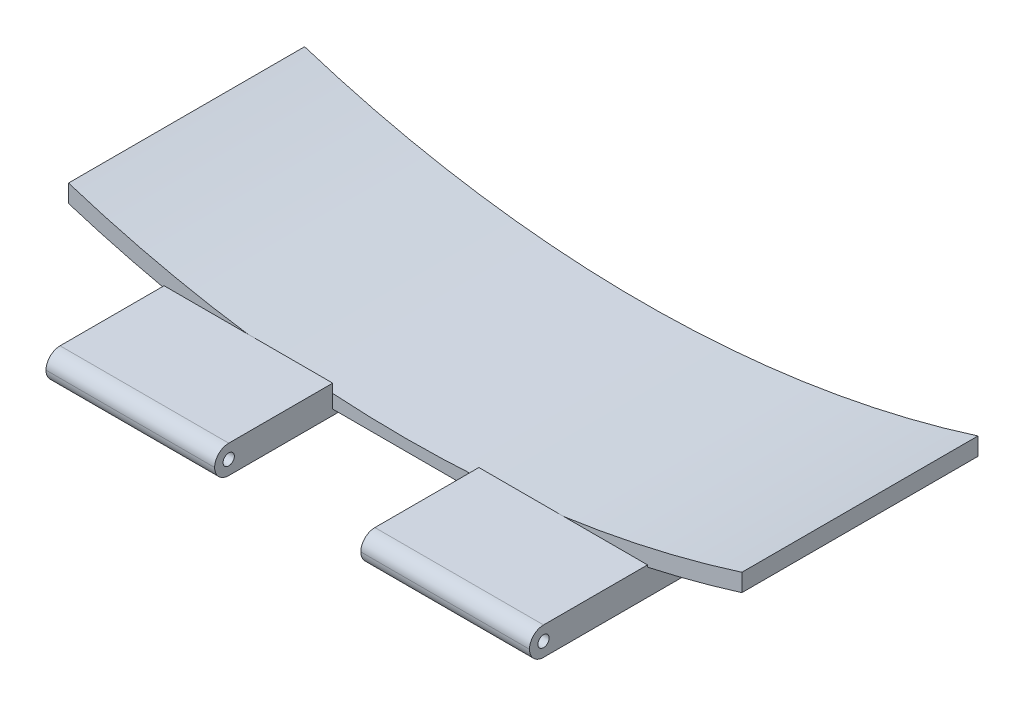
ISO-10303-21;
HEADER;
FILE_DESCRIPTION(('STEP AP214'),'2;1');
FILE_NAME('part.step','',(''),(''),'','','');
FILE_SCHEMA(('AUTOMOTIVE_DESIGN { 1 0 10303 214 1 1 1 1 }'));
ENDSEC;
DATA;
#1=APPLICATION_CONTEXT('core data for automotive mechanical design processes');
#2=APPLICATION_PROTOCOL_DEFINITION('international standard','automotive_design',2000,#1);
#3=PRODUCT_CONTEXT('',#1,'mechanical');
#4=PRODUCT('Part','Part','',(#3));
#5=PRODUCT_RELATED_PRODUCT_CATEGORY('part','',(#4));
#6=PRODUCT_DEFINITION_FORMATION('','',#4);
#7=PRODUCT_DEFINITION_CONTEXT('part definition',#1,'design');
#8=PRODUCT_DEFINITION('design','',#6,#7);
#9=PRODUCT_DEFINITION_SHAPE('','',#8);
#10=(LENGTH_UNIT() NAMED_UNIT(*) SI_UNIT(.MILLI.,.METRE.));
#11=(NAMED_UNIT(*) PLANE_ANGLE_UNIT() SI_UNIT($,.RADIAN.));
#12=(NAMED_UNIT(*) SI_UNIT($,.STERADIAN.) SOLID_ANGLE_UNIT());
#13=UNCERTAINTY_MEASURE_WITH_UNIT(LENGTH_MEASURE(1.E-05),#10,'distance_accuracy_value','');
#14=(GEOMETRIC_REPRESENTATION_CONTEXT(3) GLOBAL_UNCERTAINTY_ASSIGNED_CONTEXT((#13)) GLOBAL_UNIT_ASSIGNED_CONTEXT((#10,
#11,#12)) REPRESENTATION_CONTEXT('',''));
#15=CARTESIAN_POINT('',(0.,0.,0.));
#16=DIRECTION('',(0.,0.,1.));
#17=DIRECTION('',(1.,0.,0.));
#18=AXIS2_PLACEMENT_3D('',#15,#16,#17);
#19=CARTESIAN_POINT('',(0.,0.,42.));
#20=DIRECTION('',(0.,0.,1.));
#21=DIRECTION('',(1.,0.,0.));
#22=AXIS2_PLACEMENT_3D('',#19,#20,#21);
#23=PLANE('',#22);
#24=DIRECTION('',(-1.,0.,0.));
#25=VECTOR('',#24,1.);
#26=CARTESIAN_POINT('',(43.0443070058385,65.0035011295918,42.));
#27=LINE('',#26,#25);
#28=CARTESIAN_POINT('',(43.0443070058385,65.0035011295918,42.));
#29=VERTEX_POINT('',#28);
#30=CARTESIAN_POINT('',(28.1738527997292,65.0035011295919,42.));
#31=VERTEX_POINT('',#30);
#32=EDGE_CURVE('E184',#29,#31,#27,.T.);
#33=ORIENTED_EDGE('',*,*,#32,.F.);
#34=DIRECTION('',(0.,-1.,0.));
#35=VECTOR('',#34,1.);
#36=CARTESIAN_POINT('',(43.0443070058385,0.,42.));
#37=LINE('',#36,#35);
#38=CARTESIAN_POINT('',(43.0443070058385,64.6566663524587,42.));
#39=VERTEX_POINT('',#38);
#40=EDGE_CURVE('E323',#29,#39,#37,.T.);
#41=ORIENTED_EDGE('',*,*,#40,.T.);
#42=CARTESIAN_POINT('',(0.0443070058385071,260.413798779929,42.));
#43=DIRECTION('',(0.,0.,1.));
#44=DIRECTION('',(1.,0.,0.));
#45=AXIS2_PLACEMENT_3D('',#42,#43,#44);
#46=CIRCLE('',#45,200.424187403183);
#47=CARTESIAN_POINT('',(59.8256529075496,69.1128694084121,42.));
#48=VERTEX_POINT('',#47);
#49=EDGE_CURVE('E338',#39,#48,#46,.T.);
#50=ORIENTED_EDGE('',*,*,#49,.T.);
#51=DIRECTION('',(0.,-1.,0.));
#52=VECTOR('',#51,1.);
#53=CARTESIAN_POINT('',(59.8256529075496,0.,42.));
#54=LINE('',#53,#52);
#55=CARTESIAN_POINT('',(59.8256529075496,72.257888810181,42.));
#56=VERTEX_POINT('',#55);
#57=EDGE_CURVE('E344',#56,#48,#54,.T.);
#58=ORIENTED_EDGE('',*,*,#57,.F.);
#59=CARTESIAN_POINT('',(0.0443070058385071,260.413798779929,42.));
#60=DIRECTION('',(0.,0.,1.));
#61=DIRECTION('',(1.,0.,0.));
#62=AXIS2_PLACEMENT_3D('',#59,#60,#61);
#63=CIRCLE('',#62,197.424557171503);
#64=EDGE_CURVE('E367',#31,#56,#63,.T.);
#65=ORIENTED_EDGE('',*,*,#64,.F.);
#66=EDGE_LOOP('',(#33,#41,#50,#58,#65));
#67=FACE_BOUND('',#66,.T.);
#68=ADVANCED_FACE('F35',(#67),#23,.T.);
#69=DIRECTION('',(0.,1.,0.));
#70=VECTOR('',#69,1.);
#71=CARTESIAN_POINT('',(-12.9556929941615,60.0035011295918,42.));
#72=LINE('',#71,#70);
#73=CARTESIAN_POINT('',(-12.9556929941615,61.0035011295918,42.));
#74=VERTEX_POINT('',#73);
#75=CARTESIAN_POINT('',(-12.9556929941615,63.4177181733241,42.));
#76=VERTEX_POINT('',#75);
#77=EDGE_CURVE('E202',#74,#76,#72,.T.);
#78=ORIENTED_EDGE('',*,*,#77,.F.);
#79=DIRECTION('',(1.,0.,0.));
#80=VECTOR('',#79,1.);
#81=CARTESIAN_POINT('',(13.0443070058385,61.0035011295918,42.));
#82=LINE('',#81,#80);
#83=CARTESIAN_POINT('',(13.0443070058385,61.0035011295918,42.));
#84=VERTEX_POINT('',#83);
#85=EDGE_CURVE('E210',#74,#84,#82,.T.);
#86=ORIENTED_EDGE('',*,*,#85,.T.);
#87=DIRECTION('',(0.,1.,0.));
#88=VECTOR('',#87,1.);
#89=CARTESIAN_POINT('',(13.0443070058385,0.,42.));
#90=LINE('',#89,#88);
#91=CARTESIAN_POINT('',(13.0443070058385,63.4177181733241,42.));
#92=VERTEX_POINT('',#91);
#93=EDGE_CURVE('E218',#84,#92,#90,.T.);
#94=ORIENTED_EDGE('',*,*,#93,.T.);
#95=EDGE_CURVE('E401',#76,#92,#63,.T.);
#96=ORIENTED_EDGE('',*,*,#95,.F.);
#97=EDGE_LOOP('',(#78,#86,#94,#96));
#98=FACE_BOUND('',#97,.T.);
#99=ADVANCED_FACE('F284',(#98),#23,.T.);
#100=DIRECTION('',(0.,-1.,0.));
#101=VECTOR('',#100,1.);
#102=CARTESIAN_POINT('',(-42.9556929941615,60.0035011295918,42.));
#103=LINE('',#102,#101);
#104=CARTESIAN_POINT('',(-42.9556929941615,65.0035011295918,42.));
#105=VERTEX_POINT('',#104);
#106=CARTESIAN_POINT('',(-42.9556929941615,64.6566663524587,42.));
#107=VERTEX_POINT('',#106);
#108=EDGE_CURVE('E197',#105,#107,#103,.T.);
#109=ORIENTED_EDGE('',*,*,#108,.F.);
#110=DIRECTION('',(-1.,0.,0.));
#111=VECTOR('',#110,1.);
#112=CARTESIAN_POINT('',(-42.9556929941615,65.0035011295918,42.));
#113=LINE('',#112,#111);
#114=CARTESIAN_POINT('',(-28.0852387880522,65.0035011295919,42.));
#115=VERTEX_POINT('',#114);
#116=EDGE_CURVE('E307',#115,#105,#113,.T.);
#117=ORIENTED_EDGE('',*,*,#116,.F.);
#118=CARTESIAN_POINT('',(-59.9556929941615,72.3275000381973,42.));
#119=VERTEX_POINT('',#118);
#120=EDGE_CURVE('E330',#119,#115,#63,.T.);
#121=ORIENTED_EDGE('',*,*,#120,.F.);
#122=DIRECTION('',(0.,-1.,0.));
#123=VECTOR('',#122,1.);
#124=CARTESIAN_POINT('',(-59.9556929941615,0.,42.));
#125=LINE('',#124,#123);
#126=CARTESIAN_POINT('',(-59.9556929941615,69.1813358029906,42.));
#127=VERTEX_POINT('',#126);
#128=EDGE_CURVE('E339',#119,#127,#125,.T.);
#129=ORIENTED_EDGE('',*,*,#128,.T.);
#130=EDGE_CURVE('E310',#127,#107,#46,.T.);
#131=ORIENTED_EDGE('',*,*,#130,.T.);
#132=EDGE_LOOP('',(#109,#117,#121,#129,#131));
#133=FACE_BOUND('',#132,.T.);
#134=ADVANCED_FACE('F287',(#133),#23,.T.);
#135=CARTESIAN_POINT('',(0.0443070058385071,260.413798779929,42.));
#136=DIRECTION('',(0.,0.,-1.));
#137=DIRECTION('',(-1.,0.,0.));
#138=AXIS2_PLACEMENT_3D('',#135,#136,#137);
#139=CYLINDRICAL_SURFACE('',#138,197.424557171503);
#140=CARTESIAN_POINT('',(0.0443070058385071,260.413798779929,0.));
#141=DIRECTION('',(0.,0.,1.));
#142=DIRECTION('',(1.,0.,0.));
#143=AXIS2_PLACEMENT_3D('',#140,#141,#142);
#144=CIRCLE('',#143,197.424557171503);
#145=CARTESIAN_POINT('',(-59.9556929941615,72.3275000381973,0.));
#146=VERTEX_POINT('',#145);
#147=CARTESIAN_POINT('',(59.8256529075496,72.257888810181,0.));
#148=VERTEX_POINT('',#147);
#149=EDGE_CURVE('E226',#146,#148,#144,.T.);
#150=ORIENTED_EDGE('',*,*,#149,.F.);
#151=DIRECTION('',(0.,0.,-1.));
#152=VECTOR('',#151,1.);
#153=CARTESIAN_POINT('',(-59.9556929941615,72.3275000381973,42.));
#154=LINE('',#153,#152);
#155=EDGE_CURVE('E322',#119,#146,#154,.T.);
#156=ORIENTED_EDGE('',*,*,#155,.F.);
#157=ORIENTED_EDGE('',*,*,#120,.T.);
#158=EDGE_CURVE('E398',#115,#76,#63,.T.);
#159=ORIENTED_EDGE('',*,*,#158,.T.);
#160=ORIENTED_EDGE('',*,*,#95,.T.);
#161=EDGE_CURVE('E191',#92,#31,#63,.T.);
#162=ORIENTED_EDGE('',*,*,#161,.T.);
#163=ORIENTED_EDGE('',*,*,#64,.T.);
#164=DIRECTION('',(0.,0.,-1.));
#165=VECTOR('',#164,1.);
#166=CARTESIAN_POINT('',(59.8256529075496,72.257888810181,42.));
#167=LINE('',#166,#165);
#168=EDGE_CURVE('E347',#56,#148,#167,.T.);
#169=ORIENTED_EDGE('',*,*,#168,.T.);
#170=EDGE_LOOP('',(#150,#156,#157,#159,#160,#162,#163,#169));
#171=FACE_BOUND('',#170,.T.);
#172=ADVANCED_FACE('F295',(#171),#139,.F.);
#173=CARTESIAN_POINT('',(-59.9556929941615,0.,42.));
#174=DIRECTION('',(1.,0.,0.));
#175=DIRECTION('',(0.,0.,-1.));
#176=AXIS2_PLACEMENT_3D('',#173,#174,#175);
#177=PLANE('',#176);
#178=DIRECTION('',(0.,-1.,0.));
#179=VECTOR('',#178,1.);
#180=CARTESIAN_POINT('',(-59.9556929941615,0.,0.));
#181=LINE('',#180,#179);
#182=CARTESIAN_POINT('',(-59.9556929941615,69.1813358029906,0.));
#183=VERTEX_POINT('',#182);
#184=EDGE_CURVE('E350',#146,#183,#181,.T.);
#185=ORIENTED_EDGE('',*,*,#184,.T.);
#186=DIRECTION('',(0.,0.,-1.));
#187=VECTOR('',#186,1.);
#188=CARTESIAN_POINT('',(-59.9556929941615,69.1813358029906,42.));
#189=LINE('',#188,#187);
#190=EDGE_CURVE('E325',#127,#183,#189,.T.);
#191=ORIENTED_EDGE('',*,*,#190,.F.);
#192=ORIENTED_EDGE('',*,*,#128,.F.);
#193=ORIENTED_EDGE('',*,*,#155,.T.);
#194=EDGE_LOOP('',(#185,#191,#192,#193));
#195=FACE_BOUND('',#194,.T.);
#196=ADVANCED_FACE('F300',(#195),#177,.F.);
#197=CARTESIAN_POINT('',(0.0443070058385071,260.413798779929,42.));
#198=DIRECTION('',(0.,0.,-1.));
#199=DIRECTION('',(-1.,0.,0.));
#200=AXIS2_PLACEMENT_3D('',#197,#198,#199);
#201=CYLINDRICAL_SURFACE('',#200,200.424187403183);
#202=CARTESIAN_POINT('',(0.0443070058385071,260.413798779929,0.));
#203=DIRECTION('',(0.,0.,1.));
#204=DIRECTION('',(1.,0.,0.));
#205=AXIS2_PLACEMENT_3D('',#202,#203,#204);
#206=CIRCLE('',#205,200.424187403183);
#207=CARTESIAN_POINT('',(-42.9556929941615,64.6566663524587,0.));
#208=VERTEX_POINT('',#207);
#209=EDGE_CURVE('E352',#183,#208,#206,.T.);
#210=ORIENTED_EDGE('',*,*,#209,.T.);
#211=DIRECTION('',(0.,0.,-1.));
#212=VECTOR('',#211,1.);
#213=CARTESIAN_POINT('',(-42.9556929941615,64.6566663524587,42.));
#214=LINE('',#213,#212);
#215=EDGE_CURVE('E340',#107,#208,#214,.T.);
#216=ORIENTED_EDGE('',*,*,#215,.F.);
#217=ORIENTED_EDGE('',*,*,#130,.F.);
#218=ORIENTED_EDGE('',*,*,#190,.T.);
#219=EDGE_LOOP('',(#210,#216,#217,#218));
#220=FACE_BOUND('',#219,.T.);
#221=ADVANCED_FACE('F417',(#220),#201,.T.);
#222=CARTESIAN_POINT('',(-42.9556929941615,0.,42.));
#223=DIRECTION('',(1.,0.,0.));
#224=DIRECTION('',(0.,0.,-1.));
#225=AXIS2_PLACEMENT_3D('',#222,#223,#224);
#226=PLANE('',#225);
#227=CARTESIAN_POINT('',(-42.9556929941615,62.5035011295918,60.5));
#228=DIRECTION('',(-1.,0.,0.));
#229=DIRECTION('',(0.,0.,1.));
#230=AXIS2_PLACEMENT_3D('',#227,#228,#229);
#231=CIRCLE('',#230,0.999999999999998);
#232=CARTESIAN_POINT('',(-42.9556929941615,62.5035011295918,61.5));
#233=VERTEX_POINT('',#232);
#234=EDGE_CURVE('E265',#233,#233,#231,.T.);
#235=ORIENTED_EDGE('',*,*,#234,.F.);
#236=EDGE_LOOP('',(#235));
#237=FACE_BOUND('',#236,.T.);
#238=CARTESIAN_POINT('',(-42.9556929941615,62.5035011295918,60.5));
#239=DIRECTION('',(1.,0.,0.));
#240=DIRECTION('',(0.,0.,-1.));
#241=AXIS2_PLACEMENT_3D('',#238,#239,#240);
#242=CIRCLE('',#241,2.5);
#243=CARTESIAN_POINT('',(-42.9556929941615,60.0035011295918,60.5));
#244=VERTEX_POINT('',#243);
#245=CARTESIAN_POINT('',(-42.9556929941615,62.5035011295918,63.));
#246=VERTEX_POINT('',#245);
#247=EDGE_CURVE('E236',#244,#246,#242,.F.);
#248=ORIENTED_EDGE('',*,*,#247,.T.);
#249=CARTESIAN_POINT('',(-42.9556929941615,62.5035011295918,60.5));
#250=DIRECTION('',(1.,0.,0.));
#251=DIRECTION('',(0.,0.,-1.));
#252=AXIS2_PLACEMENT_3D('',#249,#250,#251);
#253=CIRCLE('',#252,2.5);
#254=CARTESIAN_POINT('',(-42.9556929941615,65.0035011295918,60.5));
#255=VERTEX_POINT('',#254);
#256=EDGE_CURVE('E246',#246,#255,#253,.F.);
#257=ORIENTED_EDGE('',*,*,#256,.T.);
#258=DIRECTION('',(0.,0.,-1.));
#259=VECTOR('',#258,1.);
#260=CARTESIAN_POINT('',(-42.9556929941615,65.0035011295918,63.));
#261=LINE('',#260,#259);
#262=EDGE_CURVE('E319',#255,#105,#261,.T.);
#263=ORIENTED_EDGE('',*,*,#262,.T.);
#264=ORIENTED_EDGE('',*,*,#108,.T.);
#265=ORIENTED_EDGE('',*,*,#215,.T.);
#266=DIRECTION('',(0.,-1.,0.));
#267=VECTOR('',#266,1.);
#268=CARTESIAN_POINT('',(-42.9556929941615,0.,0.));
#269=LINE('',#268,#267);
#270=CARTESIAN_POINT('',(-42.9556929941615,60.0035011295918,0.));
#271=VERTEX_POINT('',#270);
#272=EDGE_CURVE('E354',#208,#271,#269,.T.);
#273=ORIENTED_EDGE('',*,*,#272,.T.);
#274=DIRECTION('',(0.,0.,-1.));
#275=VECTOR('',#274,1.);
#276=CARTESIAN_POINT('',(-42.9556929941615,60.0035011295918,42.));
#277=LINE('',#276,#275);
#278=EDGE_CURVE('E375',#244,#271,#277,.T.);
#279=ORIENTED_EDGE('',*,*,#278,.F.);
#280=EDGE_LOOP('',(#248,#257,#263,#264,#265,#273,#279));
#281=FACE_BOUND('',#280,.T.);
#282=ADVANCED_FACE('F381',(#237,#281),#226,.F.);
#283=CARTESIAN_POINT('',(0.,60.0035011295918,42.));
#284=DIRECTION('',(0.,1.,0.));
#285=DIRECTION('',(0.,0.,1.));
#286=AXIS2_PLACEMENT_3D('',#283,#284,#285);
#287=PLANE('',#286);
#288=DIRECTION('',(0.,0.,-1.));
#289=VECTOR('',#288,1.);
#290=CARTESIAN_POINT('',(13.0443070058385,60.0035011295918,63.));
#291=LINE('',#290,#289);
#292=CARTESIAN_POINT('',(13.0443070058385,60.0035011295918,60.5));
#293=VERTEX_POINT('',#292);
#294=CARTESIAN_POINT('',(13.0443070058385,60.0035011295918,41.));
#295=VERTEX_POINT('',#294);
#296=EDGE_CURVE('E51',#293,#295,#291,.T.);
#297=ORIENTED_EDGE('',*,*,#296,.T.);
#298=DIRECTION('',(-1.,0.,0.));
#299=VECTOR('',#298,1.);
#300=CARTESIAN_POINT('',(-12.9556929941615,60.0035011295918,41.));
#301=LINE('',#300,#299);
#302=CARTESIAN_POINT('',(-12.9556929941615,60.0035011295918,41.));
#303=VERTEX_POINT('',#302);
#304=EDGE_CURVE('E213',#295,#303,#301,.T.);
#305=ORIENTED_EDGE('',*,*,#304,.T.);
#306=DIRECTION('',(0.,0.,-1.));
#307=VECTOR('',#306,1.);
#308=CARTESIAN_POINT('',(-12.9556929941615,60.0035011295918,63.));
#309=LINE('',#308,#307);
#310=CARTESIAN_POINT('',(-12.9556929941615,60.0035011295918,60.5));
#311=VERTEX_POINT('',#310);
#312=EDGE_CURVE('E58',#311,#303,#309,.T.);
#313=ORIENTED_EDGE('',*,*,#312,.F.);
#314=DIRECTION('',(1.,0.,0.));
#315=VECTOR('',#314,1.);
#316=CARTESIAN_POINT('',(0.,60.0035011295918,60.5));
#317=LINE('',#316,#315);
#318=EDGE_CURVE('E224',#311,#244,#317,.F.);
#319=ORIENTED_EDGE('',*,*,#318,.T.);
#320=ORIENTED_EDGE('',*,*,#278,.T.);
#321=DIRECTION('',(1.,0.,0.));
#322=VECTOR('',#321,1.);
#323=CARTESIAN_POINT('',(0.,60.0035011295918,0.));
#324=LINE('',#323,#322);
#325=CARTESIAN_POINT('',(43.0443070058385,60.0035011295918,0.));
#326=VERTEX_POINT('',#325);
#327=EDGE_CURVE('E358',#271,#326,#324,.T.);
#328=ORIENTED_EDGE('',*,*,#327,.T.);
#329=DIRECTION('',(0.,0.,-1.));
#330=VECTOR('',#329,1.);
#331=CARTESIAN_POINT('',(43.0443070058385,60.0035011295918,42.));
#332=LINE('',#331,#330);
#333=CARTESIAN_POINT('',(43.0443070058385,60.0035011295918,60.5));
#334=VERTEX_POINT('',#333);
#335=EDGE_CURVE('E373',#334,#326,#332,.T.);
#336=ORIENTED_EDGE('',*,*,#335,.F.);
#337=DIRECTION('',(1.,0.,0.));
#338=VECTOR('',#337,1.);
#339=CARTESIAN_POINT('',(13.0443070058385,60.0035011295918,60.5));
#340=LINE('',#339,#338);
#341=EDGE_CURVE('E237',#334,#293,#340,.F.);
#342=ORIENTED_EDGE('',*,*,#341,.T.);
#343=EDGE_LOOP('',(#297,#305,#313,#319,#320,#328,#336,#342));
#344=FACE_BOUND('',#343,.T.);
#345=ADVANCED_FACE('F222',(#344),#287,.F.);
#346=CARTESIAN_POINT('',(43.0443070058385,0.,42.));
#347=DIRECTION('',(1.,0.,0.));
#348=DIRECTION('',(0.,0.,-1.));
#349=AXIS2_PLACEMENT_3D('',#346,#347,#348);
#350=PLANE('',#349);
#351=CARTESIAN_POINT('',(43.0443070058385,62.5035011295918,60.5));
#352=DIRECTION('',(1.,0.,0.));
#353=DIRECTION('',(0.,0.,-1.));
#354=AXIS2_PLACEMENT_3D('',#351,#352,#353);
#355=CIRCLE('',#354,0.999999999999998);
#356=CARTESIAN_POINT('',(43.0443070058385,62.5035011295918,61.5));
#357=VERTEX_POINT('',#356);
#358=EDGE_CURVE('E255',#357,#357,#355,.T.);
#359=ORIENTED_EDGE('',*,*,#358,.F.);
#360=EDGE_LOOP('',(#359));
#361=FACE_BOUND('',#360,.T.);
#362=DIRECTION('',(0.,0.,-1.));
#363=VECTOR('',#362,1.);
#364=CARTESIAN_POINT('',(43.0443070058385,65.0035011295918,63.));
#365=LINE('',#364,#363);
#366=CARTESIAN_POINT('',(43.0443070058385,65.0035011295918,60.5));
#367=VERTEX_POINT('',#366);
#368=EDGE_CURVE('E177',#367,#29,#365,.T.);
#369=ORIENTED_EDGE('',*,*,#368,.F.);
#370=CARTESIAN_POINT('',(43.0443070058385,62.5035011295918,60.5));
#371=DIRECTION('',(1.,0.,0.));
#372=DIRECTION('',(0.,0.,-1.));
#373=AXIS2_PLACEMENT_3D('',#370,#371,#372);
#374=CIRCLE('',#373,2.5);
#375=CARTESIAN_POINT('',(43.0443070058385,62.5035011295918,63.));
#376=VERTEX_POINT('',#375);
#377=EDGE_CURVE('E238',#367,#376,#374,.T.);
#378=ORIENTED_EDGE('',*,*,#377,.T.);
#379=CARTESIAN_POINT('',(43.0443070058385,62.5035011295918,60.5));
#380=DIRECTION('',(1.,0.,0.));
#381=DIRECTION('',(0.,0.,-1.));
#382=AXIS2_PLACEMENT_3D('',#379,#380,#381);
#383=CIRCLE('',#382,2.5);
#384=EDGE_CURVE('E241',#376,#334,#383,.T.);
#385=ORIENTED_EDGE('',*,*,#384,.T.);
#386=ORIENTED_EDGE('',*,*,#335,.T.);
#387=DIRECTION('',(0.,-1.,0.));
#388=VECTOR('',#387,1.);
#389=CARTESIAN_POINT('',(43.0443070058385,0.,0.));
#390=LINE('',#389,#388);
#391=CARTESIAN_POINT('',(43.0443070058385,64.6566663524587,0.));
#392=VERTEX_POINT('',#391);
#393=EDGE_CURVE('E361',#392,#326,#390,.T.);
#394=ORIENTED_EDGE('',*,*,#393,.F.);
#395=DIRECTION('',(0.,0.,-1.));
#396=VECTOR('',#395,1.);
#397=CARTESIAN_POINT('',(43.0443070058385,64.6566663524587,42.));
#398=LINE('',#397,#396);
#399=EDGE_CURVE('E371',#39,#392,#398,.T.);
#400=ORIENTED_EDGE('',*,*,#399,.F.);
#401=ORIENTED_EDGE('',*,*,#40,.F.);
#402=EDGE_LOOP('',(#369,#378,#385,#386,#394,#400,#401));
#403=FACE_BOUND('',#402,.T.);
#404=ADVANCED_FACE('F430',(#361,#403),#350,.T.);
#405=CARTESIAN_POINT('',(59.8256529075496,69.1128694084121,0.));
#406=VERTEX_POINT('',#405);
#407=EDGE_CURVE('E355',#392,#406,#206,.T.);
#408=ORIENTED_EDGE('',*,*,#407,.T.);
#409=DIRECTION('',(0.,0.,-1.));
#410=VECTOR('',#409,1.);
#411=CARTESIAN_POINT('',(59.8256529075496,69.1128694084121,42.));
#412=LINE('',#411,#410);
#413=EDGE_CURVE('E369',#48,#406,#412,.T.);
#414=ORIENTED_EDGE('',*,*,#413,.F.);
#415=ORIENTED_EDGE('',*,*,#49,.F.);
#416=ORIENTED_EDGE('',*,*,#399,.T.);
#417=EDGE_LOOP('',(#408,#414,#415,#416));
#418=FACE_BOUND('',#417,.T.);
#419=ADVANCED_FACE('F414',(#418),#201,.T.);
#420=CARTESIAN_POINT('',(59.8256529075496,0.,42.));
#421=DIRECTION('',(1.,0.,0.));
#422=DIRECTION('',(0.,0.,-1.));
#423=AXIS2_PLACEMENT_3D('',#420,#421,#422);
#424=PLANE('',#423);
#425=DIRECTION('',(0.,-1.,0.));
#426=VECTOR('',#425,1.);
#427=CARTESIAN_POINT('',(59.8256529075496,0.,0.));
#428=LINE('',#427,#426);
#429=EDGE_CURVE('E364',#148,#406,#428,.T.);
#430=ORIENTED_EDGE('',*,*,#429,.F.);
#431=ORIENTED_EDGE('',*,*,#168,.F.);
#432=ORIENTED_EDGE('',*,*,#57,.T.);
#433=ORIENTED_EDGE('',*,*,#413,.T.);
#434=EDGE_LOOP('',(#430,#431,#432,#433));
#435=FACE_BOUND('',#434,.T.);
#436=ADVANCED_FACE('F407',(#435),#424,.T.);
#437=CARTESIAN_POINT('',(0.,0.,0.));
#438=DIRECTION('',(0.,0.,1.));
#439=DIRECTION('',(1.,0.,0.));
#440=AXIS2_PLACEMENT_3D('',#437,#438,#439);
#441=PLANE('',#440);
#442=ORIENTED_EDGE('',*,*,#149,.T.);
#443=ORIENTED_EDGE('',*,*,#429,.T.);
#444=ORIENTED_EDGE('',*,*,#407,.F.);
#445=ORIENTED_EDGE('',*,*,#393,.T.);
#446=ORIENTED_EDGE('',*,*,#327,.F.);
#447=ORIENTED_EDGE('',*,*,#272,.F.);
#448=ORIENTED_EDGE('',*,*,#209,.F.);
#449=ORIENTED_EDGE('',*,*,#184,.F.);
#450=EDGE_LOOP('',(#442,#443,#444,#445,#446,#447,#448,#449));
#451=FACE_BOUND('',#450,.T.);
#452=ADVANCED_FACE('F384',(#451),#441,.F.);
#453=CARTESIAN_POINT('',(0.,0.,42.));
#454=DIRECTION('',(0.,0.,-1.));
#455=DIRECTION('',(-1.,0.,0.));
#456=AXIS2_PLACEMENT_3D('',#453,#454,#455);
#457=PLANE('',#456);
#458=ORIENTED_EDGE('',*,*,#158,.F.);
#459=CARTESIAN_POINT('',(-12.9556929941615,65.0035011295918,42.));
#460=VERTEX_POINT('',#459);
#461=EDGE_CURVE('E203',#460,#115,#113,.T.);
#462=ORIENTED_EDGE('',*,*,#461,.F.);
#463=EDGE_CURVE('E198',#76,#460,#72,.T.);
#464=ORIENTED_EDGE('',*,*,#463,.F.);
#465=EDGE_LOOP('',(#458,#462,#464));
#466=FACE_BOUND('',#465,.T.);
#467=ADVANCED_FACE('F397',(#466),#457,.T.);
#468=CARTESIAN_POINT('',(-12.9556929941615,60.0035011295918,63.));
#469=DIRECTION('',(-1.,0.,0.));
#470=DIRECTION('',(0.,0.,1.));
#471=AXIS2_PLACEMENT_3D('',#468,#469,#470);
#472=PLANE('',#471);
#473=CARTESIAN_POINT('',(-12.9556929941615,62.5035011295918,60.5));
#474=DIRECTION('',(-1.,0.,0.));
#475=DIRECTION('',(0.,0.,1.));
#476=AXIS2_PLACEMENT_3D('',#473,#474,#475);
#477=CIRCLE('',#476,0.999999999999998);
#478=CARTESIAN_POINT('',(-12.9556929941615,62.5035011295918,61.5));
#479=VERTEX_POINT('',#478);
#480=EDGE_CURVE('E259',#479,#479,#477,.T.);
#481=ORIENTED_EDGE('',*,*,#480,.T.);
#482=EDGE_LOOP('',(#481));
#483=FACE_BOUND('',#482,.T.);
#484=DIRECTION('',(0.,0.,-1.));
#485=VECTOR('',#484,1.);
#486=CARTESIAN_POINT('',(-12.9556929941615,65.0035011295918,63.));
#487=LINE('',#486,#485);
#488=CARTESIAN_POINT('',(-12.9556929941615,65.0035011295918,60.5));
#489=VERTEX_POINT('',#488);
#490=EDGE_CURVE('E227',#489,#460,#487,.T.);
#491=ORIENTED_EDGE('',*,*,#490,.F.);
#492=CARTESIAN_POINT('',(-12.9556929941615,62.5035011295918,60.5));
#493=DIRECTION('',(-1.,0.,0.));
#494=DIRECTION('',(0.,0.,1.));
#495=AXIS2_PLACEMENT_3D('',#492,#493,#494);
#496=CIRCLE('',#495,2.5);
#497=CARTESIAN_POINT('',(-12.9556929941615,62.5035011295918,63.));
#498=VERTEX_POINT('',#497);
#499=EDGE_CURVE('E214',#489,#498,#496,.F.);
#500=ORIENTED_EDGE('',*,*,#499,.T.);
#501=CARTESIAN_POINT('',(-12.9556929941615,62.5035011295918,60.5));
#502=DIRECTION('',(-1.,0.,0.));
#503=DIRECTION('',(0.,0.,1.));
#504=AXIS2_PLACEMENT_3D('',#501,#502,#503);
#505=CIRCLE('',#504,2.5);
#506=EDGE_CURVE('E234',#498,#311,#505,.F.);
#507=ORIENTED_EDGE('',*,*,#506,.T.);
#508=ORIENTED_EDGE('',*,*,#312,.T.);
#509=DIRECTION('',(0.,0.707106781186547,0.707106781186547));
#510=VECTOR('',#509,1.);
#511=CARTESIAN_POINT('',(-12.9556929941615,71.0035011295918,52.));
#512=LINE('',#511,#510);
#513=EDGE_CURVE('E11',#303,#74,#512,.T.);
#514=ORIENTED_EDGE('',*,*,#513,.T.);
#515=ORIENTED_EDGE('',*,*,#77,.T.);
#516=ORIENTED_EDGE('',*,*,#463,.T.);
#517=EDGE_LOOP('',(#491,#500,#507,#508,#514,#515,#516));
#518=FACE_BOUND('',#517,.T.);
#519=ADVANCED_FACE('F391',(#483,#518),#472,.F.);
#520=CARTESIAN_POINT('',(-42.9556929941615,65.0035011295918,63.));
#521=DIRECTION('',(0.,-1.,0.));
#522=DIRECTION('',(0.,0.,-1.));
#523=AXIS2_PLACEMENT_3D('',#520,#521,#522);
#524=PLANE('',#523);
#525=ORIENTED_EDGE('',*,*,#262,.F.);
#526=DIRECTION('',(-1.,0.,0.));
#527=VECTOR('',#526,1.);
#528=CARTESIAN_POINT('',(-42.9556929941615,65.0035011295918,60.5));
#529=LINE('',#528,#527);
#530=EDGE_CURVE('E248',#255,#489,#529,.F.);
#531=ORIENTED_EDGE('',*,*,#530,.T.);
#532=ORIENTED_EDGE('',*,*,#490,.T.);
#533=ORIENTED_EDGE('',*,*,#461,.T.);
#534=ORIENTED_EDGE('',*,*,#116,.T.);
#535=EDGE_LOOP('',(#525,#531,#532,#533,#534));
#536=FACE_BOUND('',#535,.T.);
#537=ADVANCED_FACE('F318',(#536),#524,.F.);
#538=CARTESIAN_POINT('',(43.0443070058385,65.0035011295918,63.));
#539=DIRECTION('',(0.,-1.,0.));
#540=DIRECTION('',(0.,0.,-1.));
#541=AXIS2_PLACEMENT_3D('',#538,#539,#540);
#542=PLANE('',#541);
#543=DIRECTION('',(0.,0.,-1.));
#544=VECTOR('',#543,1.);
#545=CARTESIAN_POINT('',(13.0443070058385,65.0035011295918,63.));
#546=LINE('',#545,#544);
#547=CARTESIAN_POINT('',(13.0443070058385,65.0035011295918,60.5));
#548=VERTEX_POINT('',#547);
#549=CARTESIAN_POINT('',(13.0443070058385,65.0035011295918,42.));
#550=VERTEX_POINT('',#549);
#551=EDGE_CURVE('E166',#548,#550,#546,.T.);
#552=ORIENTED_EDGE('',*,*,#551,.F.);
#553=DIRECTION('',(-1.,0.,0.));
#554=VECTOR('',#553,1.);
#555=CARTESIAN_POINT('',(43.0443070058385,65.0035011295918,60.5));
#556=LINE('',#555,#554);
#557=EDGE_CURVE('E618',#548,#367,#556,.F.);
#558=ORIENTED_EDGE('',*,*,#557,.T.);
#559=ORIENTED_EDGE('',*,*,#368,.T.);
#560=ORIENTED_EDGE('',*,*,#32,.T.);
#561=EDGE_CURVE('E181',#31,#550,#27,.T.);
#562=ORIENTED_EDGE('',*,*,#561,.T.);
#563=EDGE_LOOP('',(#552,#558,#559,#560,#562));
#564=FACE_BOUND('',#563,.T.);
#565=ADVANCED_FACE('F182',(#564),#542,.F.);
#566=CARTESIAN_POINT('',(13.0443070058385,60.0035011295918,63.));
#567=DIRECTION('',(1.,0.,0.));
#568=DIRECTION('',(0.,0.,-1.));
#569=AXIS2_PLACEMENT_3D('',#566,#567,#568);
#570=PLANE('',#569);
#571=CARTESIAN_POINT('',(13.0443070058385,62.5035011295918,60.5));
#572=DIRECTION('',(1.,0.,0.));
#573=DIRECTION('',(0.,0.,-1.));
#574=AXIS2_PLACEMENT_3D('',#571,#572,#573);
#575=CIRCLE('',#574,0.999999999999998);
#576=CARTESIAN_POINT('',(13.0443070058385,62.5035011295918,61.5));
#577=VERTEX_POINT('',#576);
#578=EDGE_CURVE('E39',#577,#577,#575,.T.);
#579=ORIENTED_EDGE('',*,*,#578,.T.);
#580=EDGE_LOOP('',(#579));
#581=FACE_BOUND('',#580,.T.);
#582=CARTESIAN_POINT('',(13.0443070058385,62.5035011295918,60.5));
#583=DIRECTION('',(1.,0.,0.));
#584=DIRECTION('',(0.,0.,-1.));
#585=AXIS2_PLACEMENT_3D('',#582,#583,#584);
#586=CIRCLE('',#585,2.5);
#587=CARTESIAN_POINT('',(13.0443070058385,62.5035011295918,63.));
#588=VERTEX_POINT('',#587);
#589=EDGE_CURVE('E616',#293,#588,#586,.F.);
#590=ORIENTED_EDGE('',*,*,#589,.T.);
#591=CARTESIAN_POINT('',(13.0443070058385,62.5035011295918,60.5));
#592=DIRECTION('',(1.,0.,0.));
#593=DIRECTION('',(0.,0.,-1.));
#594=AXIS2_PLACEMENT_3D('',#591,#592,#593);
#595=CIRCLE('',#594,2.5);
#596=EDGE_CURVE('E173',#588,#548,#595,.F.);
#597=ORIENTED_EDGE('',*,*,#596,.T.);
#598=ORIENTED_EDGE('',*,*,#551,.T.);
#599=DIRECTION('',(0.,-1.,0.));
#600=VECTOR('',#599,1.);
#601=CARTESIAN_POINT('',(13.0443070058385,60.0035011295918,42.));
#602=LINE('',#601,#600);
#603=EDGE_CURVE('E171',#550,#92,#602,.T.);
#604=ORIENTED_EDGE('',*,*,#603,.T.);
#605=ORIENTED_EDGE('',*,*,#93,.F.);
#606=DIRECTION('',(0.,-0.707106781186548,-0.707106781186548));
#607=VECTOR('',#606,1.);
#608=CARTESIAN_POINT('',(13.0443070058385,71.0035011295918,52.));
#609=LINE('',#608,#607);
#610=EDGE_CURVE('E44',#84,#295,#609,.T.);
#611=ORIENTED_EDGE('',*,*,#610,.T.);
#612=ORIENTED_EDGE('',*,*,#296,.F.);
#613=EDGE_LOOP('',(#590,#597,#598,#604,#605,#611,#612));
#614=FACE_BOUND('',#613,.T.);
#615=ADVANCED_FACE('F168',(#581,#614),#570,.F.);
#616=CARTESIAN_POINT('',(0.,0.,42.));
#617=DIRECTION('',(0.,0.,1.));
#618=DIRECTION('',(1.,0.,0.));
#619=AXIS2_PLACEMENT_3D('',#616,#617,#618);
#620=PLANE('',#619);
#621=ORIENTED_EDGE('',*,*,#161,.F.);
#622=ORIENTED_EDGE('',*,*,#603,.F.);
#623=ORIENTED_EDGE('',*,*,#561,.F.);
#624=EDGE_LOOP('',(#621,#622,#623));
#625=FACE_BOUND('',#624,.T.);
#626=ADVANCED_FACE('F189',(#625),#620,.F.);
#627=CARTESIAN_POINT('',(0.,62.5035011295918,60.5));
#628=DIRECTION('',(-1.,0.,0.));
#629=DIRECTION('',(0.,0.,1.));
#630=AXIS2_PLACEMENT_3D('',#627,#628,#629);
#631=CYLINDRICAL_SURFACE('',#630,2.5);
#632=ORIENTED_EDGE('',*,*,#341,.F.);
#633=ORIENTED_EDGE('',*,*,#384,.F.);
#634=DIRECTION('',(1.,0.,0.));
#635=VECTOR('',#634,1.);
#636=CARTESIAN_POINT('',(43.0443070058385,62.5035011295918,63.));
#637=LINE('',#636,#635);
#638=EDGE_CURVE('E187',#588,#376,#637,.T.);
#639=ORIENTED_EDGE('',*,*,#638,.F.);
#640=ORIENTED_EDGE('',*,*,#589,.F.);
#641=EDGE_LOOP('',(#632,#633,#639,#640));
#642=FACE_BOUND('',#641,.T.);
#643=ADVANCED_FACE('F445',(#642),#631,.T.);
#644=CARTESIAN_POINT('',(0.,62.5035011295918,60.5));
#645=DIRECTION('',(1.,0.,0.));
#646=DIRECTION('',(0.,0.,-1.));
#647=AXIS2_PLACEMENT_3D('',#644,#645,#646);
#648=CYLINDRICAL_SURFACE('',#647,2.5);
#649=ORIENTED_EDGE('',*,*,#377,.F.);
#650=ORIENTED_EDGE('',*,*,#557,.F.);
#651=ORIENTED_EDGE('',*,*,#596,.F.);
#652=ORIENTED_EDGE('',*,*,#638,.T.);
#653=EDGE_LOOP('',(#649,#650,#651,#652));
#654=FACE_BOUND('',#653,.T.);
#655=ADVANCED_FACE('F442',(#654),#648,.T.);
#656=CARTESIAN_POINT('',(0.,62.5035011295918,60.5));
#657=DIRECTION('',(1.,0.,0.));
#658=DIRECTION('',(0.,0.,-1.));
#659=AXIS2_PLACEMENT_3D('',#656,#657,#658);
#660=CYLINDRICAL_SURFACE('',#659,2.5);
#661=ORIENTED_EDGE('',*,*,#318,.F.);
#662=ORIENTED_EDGE('',*,*,#506,.F.);
#663=DIRECTION('',(1.,0.,0.));
#664=VECTOR('',#663,1.);
#665=CARTESIAN_POINT('',(0.,62.5035011295918,63.));
#666=LINE('',#665,#664);
#667=EDGE_CURVE('E208',#246,#498,#666,.T.);
#668=ORIENTED_EDGE('',*,*,#667,.F.);
#669=ORIENTED_EDGE('',*,*,#247,.F.);
#670=EDGE_LOOP('',(#661,#662,#668,#669));
#671=FACE_BOUND('',#670,.T.);
#672=ADVANCED_FACE('F232',(#671),#660,.T.);
#673=CARTESIAN_POINT('',(0.,62.5035011295918,60.5));
#674=DIRECTION('',(-1.,0.,0.));
#675=DIRECTION('',(0.,0.,1.));
#676=AXIS2_PLACEMENT_3D('',#673,#674,#675);
#677=CYLINDRICAL_SURFACE('',#676,2.5);
#678=ORIENTED_EDGE('',*,*,#499,.F.);
#679=ORIENTED_EDGE('',*,*,#530,.F.);
#680=ORIENTED_EDGE('',*,*,#256,.F.);
#681=ORIENTED_EDGE('',*,*,#667,.T.);
#682=EDGE_LOOP('',(#678,#679,#680,#681));
#683=FACE_BOUND('',#682,.T.);
#684=ADVANCED_FACE('F281',(#683),#677,.T.);
#685=CARTESIAN_POINT('',(0.,61.0035011295918,42.));
#686=DIRECTION('',(0.,-0.707106781186547,0.707106781186547));
#687=DIRECTION('',(-1.,0.,0.));
#688=AXIS2_PLACEMENT_3D('',#685,#686,#687);
#689=PLANE('',#688);
#690=ORIENTED_EDGE('',*,*,#513,.F.);
#691=ORIENTED_EDGE('',*,*,#304,.F.);
#692=ORIENTED_EDGE('',*,*,#610,.F.);
#693=ORIENTED_EDGE('',*,*,#85,.F.);
#694=EDGE_LOOP('',(#690,#691,#692,#693));
#695=FACE_BOUND('',#694,.T.);
#696=ADVANCED_FACE('F37',(#695),#689,.T.);
#697=CARTESIAN_POINT('',(59.8256529075496,62.5035011295918,60.5));
#698=DIRECTION('',(-1.,0.,0.));
#699=DIRECTION('',(0.,0.,1.));
#700=AXIS2_PLACEMENT_3D('',#697,#698,#699);
#701=CYLINDRICAL_SURFACE('',#700,0.999999999999998);
#702=CARTESIAN_POINT('',(43.0443070058385,62.5035011295918,61.5));
#703=CARTESIAN_POINT('',(42.7318070058385,62.5035011295918,61.5));
#704=CARTESIAN_POINT('',(42.4193070058385,62.5035011295918,61.5));
#705=CARTESIAN_POINT('',(41.7943070058385,62.5035011295918,61.5));
#706=CARTESIAN_POINT('',(41.4818070058385,62.5035011295918,61.5));
#707=CARTESIAN_POINT('',(40.8568070058385,62.5035011295918,61.5));
#708=CARTESIAN_POINT('',(40.5443070058385,62.5035011295918,61.5));
#709=CARTESIAN_POINT('',(39.9193070058385,62.5035011295918,61.5));
#710=CARTESIAN_POINT('',(39.6068070058385,62.5035011295918,61.5));
#711=CARTESIAN_POINT('',(38.9818070058385,62.5035011295918,61.5));
#712=CARTESIAN_POINT('',(38.6693070058385,62.5035011295918,61.5));
#713=CARTESIAN_POINT('',(38.0443070058385,62.5035011295918,61.5));
#714=CARTESIAN_POINT('',(37.7318070058385,62.5035011295918,61.5));
#715=CARTESIAN_POINT('',(37.1068070058385,62.5035011295918,61.5));
#716=CARTESIAN_POINT('',(36.7943070058385,62.5035011295918,61.5));
#717=CARTESIAN_POINT('',(36.1693070058385,62.5035011295918,61.5));
#718=CARTESIAN_POINT('',(35.8568070058385,62.5035011295918,61.5));
#719=CARTESIAN_POINT('',(35.2318070058385,62.5035011295918,61.5));
#720=CARTESIAN_POINT('',(34.9193070058385,62.5035011295918,61.5));
#721=CARTESIAN_POINT('',(34.2943070058385,62.5035011295918,61.5));
#722=CARTESIAN_POINT('',(33.9818070058385,62.5035011295918,61.5));
#723=CARTESIAN_POINT('',(33.3568070058385,62.5035011295918,61.5));
#724=CARTESIAN_POINT('',(33.0443070058385,62.5035011295918,61.5));
#725=CARTESIAN_POINT('',(32.4193070058385,62.5035011295918,61.5));
#726=CARTESIAN_POINT('',(32.1068070058385,62.5035011295918,61.5));
#727=CARTESIAN_POINT('',(31.4818070058385,62.5035011295918,61.5));
#728=CARTESIAN_POINT('',(31.1693070058385,62.5035011295918,61.5));
#729=CARTESIAN_POINT('',(30.5443070058385,62.5035011295918,61.5));
#730=CARTESIAN_POINT('',(30.2318070058385,62.5035011295918,61.5));
#731=CARTESIAN_POINT('',(29.6068070058385,62.5035011295918,61.5));
#732=CARTESIAN_POINT('',(29.2943070058385,62.5035011295918,61.5));
#733=CARTESIAN_POINT('',(28.6693070058385,62.5035011295918,61.5));
#734=CARTESIAN_POINT('',(28.3568070058385,62.5035011295918,61.5));
#735=CARTESIAN_POINT('',(27.7318070058385,62.5035011295918,61.5));
#736=CARTESIAN_POINT('',(27.4193070058385,62.5035011295918,61.5));
#737=CARTESIAN_POINT('',(26.7943070058385,62.5035011295918,61.5));
#738=CARTESIAN_POINT('',(26.4818070058385,62.5035011295918,61.5));
#739=CARTESIAN_POINT('',(25.8568070058385,62.5035011295918,61.5));
#740=CARTESIAN_POINT('',(25.5443070058385,62.5035011295918,61.5));
#741=CARTESIAN_POINT('',(24.9193070058385,62.5035011295918,61.5));
#742=CARTESIAN_POINT('',(24.6068070058385,62.5035011295918,61.5));
#743=CARTESIAN_POINT('',(23.9818070058385,62.5035011295918,61.5));
#744=CARTESIAN_POINT('',(23.6693070058385,62.5035011295918,61.5));
#745=CARTESIAN_POINT('',(23.0443070058385,62.5035011295918,61.5));
#746=CARTESIAN_POINT('',(22.7318070058385,62.5035011295918,61.5));
#747=CARTESIAN_POINT('',(22.1068070058385,62.5035011295918,61.5));
#748=CARTESIAN_POINT('',(21.7943070058385,62.5035011295918,61.5));
#749=CARTESIAN_POINT('',(21.1693070058385,62.5035011295918,61.5));
#750=CARTESIAN_POINT('',(20.8568070058385,62.5035011295918,61.5));
#751=CARTESIAN_POINT('',(20.2318070058385,62.5035011295918,61.5));
#752=CARTESIAN_POINT('',(19.9193070058385,62.5035011295918,61.5));
#753=CARTESIAN_POINT('',(19.2943070058385,62.5035011295918,61.5));
#754=CARTESIAN_POINT('',(18.9818070058385,62.5035011295918,61.5));
#755=CARTESIAN_POINT('',(18.3568070058385,62.5035011295918,61.5));
#756=CARTESIAN_POINT('',(18.0443070058385,62.5035011295918,61.5));
#757=CARTESIAN_POINT('',(17.4193070058385,62.5035011295918,61.5));
#758=CARTESIAN_POINT('',(17.1068070058385,62.5035011295918,61.5));
#759=CARTESIAN_POINT('',(16.4818070058385,62.5035011295918,61.5));
#760=CARTESIAN_POINT('',(16.1693070058385,62.5035011295918,61.5));
#761=CARTESIAN_POINT('',(15.5443070058385,62.5035011295918,61.5));
#762=CARTESIAN_POINT('',(15.2318070058385,62.5035011295918,61.5));
#763=CARTESIAN_POINT('',(14.6068070058385,62.5035011295918,61.5));
#764=CARTESIAN_POINT('',(14.2943070058385,62.5035011295918,61.5));
#765=CARTESIAN_POINT('',(13.6693070058385,62.5035011295918,61.5));
#766=CARTESIAN_POINT('',(13.3568070058385,62.5035011295918,61.5));
#767=CARTESIAN_POINT('',(13.0443070058385,62.5035011295918,61.5));
#768=B_SPLINE_CURVE_WITH_KNOTS('',3,(#702,#703,#704,#705,#706,#707,#708,#709,#710,#711,#712,
#713,#714,#715,#716,#717,#718,#719,#720,#721,#722,#723,#724,#725,#726,#727,#728,#729,#730,#731,
#732,#733,#734,#735,#736,#737,#738,#739,#740,#741,#742,#743,#744,#745,#746,#747,#748,#749,#750,
#751,#752,#753,#754,#755,#756,#757,#758,#759,#760,#761,#762,#763,#764,#765,#766,#767),
.UNSPECIFIED.,.F.,.F.,(4,2,2,2,2,2,2,2,2,2,2,2,2,2,2,2,2,2,2,2,2,2,2,2,2,2,2,2,2,2,2,2,4),(0.,
0.937500000000008,1.875,2.81250000000001,3.75,4.6875,5.62500000000001,6.56250000000001,
7.50000000000001,8.4375,9.37500000000001,10.3125,11.25,12.1875,13.125,14.0625,15.,15.9375,
16.875,17.8125,18.75,19.6875,20.625,21.5625,22.5,23.4375,24.375,25.3125,26.25,27.1875,28.125,
29.0625,30.),.UNSPECIFIED.);
#769=EDGE_CURVE('BSEAM273',#357,#577,#768,.T.);
#770=ORIENTED_EDGE('',*,*,#358,.T.);
#771=ORIENTED_EDGE('',*,*,#578,.F.);
#772=ORIENTED_EDGE('',*,*,#769,.T.);
#773=ORIENTED_EDGE('',*,*,#769,.F.);
#774=EDGE_LOOP('',(#770,#772,#771,#773));
#775=FACE_BOUND('',#774,.T.);
#776=ADVANCED_FACE('F273',(#775),#701,.F.);
#777=CARTESIAN_POINT('',(-42.9556929941615,62.5035011295918,61.5));
#778=CARTESIAN_POINT('',(-42.6431929941615,62.5035011295918,61.5));
#779=CARTESIAN_POINT('',(-42.3306929941615,62.5035011295918,61.5));
#780=CARTESIAN_POINT('',(-41.7056929941615,62.5035011295918,61.5));
#781=CARTESIAN_POINT('',(-41.3931929941615,62.5035011295918,61.5));
#782=CARTESIAN_POINT('',(-40.7681929941615,62.5035011295918,61.5));
#783=CARTESIAN_POINT('',(-40.4556929941615,62.5035011295918,61.5));
#784=CARTESIAN_POINT('',(-39.8306929941615,62.5035011295918,61.5));
#785=CARTESIAN_POINT('',(-39.5181929941615,62.5035011295918,61.5));
#786=CARTESIAN_POINT('',(-38.8931929941615,62.5035011295918,61.5));
#787=CARTESIAN_POINT('',(-38.5806929941615,62.5035011295918,61.5));
#788=CARTESIAN_POINT('',(-37.9556929941615,62.5035011295918,61.5));
#789=CARTESIAN_POINT('',(-37.6431929941615,62.5035011295918,61.5));
#790=CARTESIAN_POINT('',(-37.0181929941615,62.5035011295918,61.5));
#791=CARTESIAN_POINT('',(-36.7056929941615,62.5035011295918,61.5));
#792=CARTESIAN_POINT('',(-36.0806929941615,62.5035011295918,61.5));
#793=CARTESIAN_POINT('',(-35.7681929941615,62.5035011295918,61.5));
#794=CARTESIAN_POINT('',(-35.1431929941615,62.5035011295918,61.5));
#795=CARTESIAN_POINT('',(-34.8306929941615,62.5035011295918,61.5));
#796=CARTESIAN_POINT('',(-34.2056929941615,62.5035011295918,61.5));
#797=CARTESIAN_POINT('',(-33.8931929941615,62.5035011295918,61.5));
#798=CARTESIAN_POINT('',(-33.2681929941615,62.5035011295918,61.5));
#799=CARTESIAN_POINT('',(-32.9556929941615,62.5035011295918,61.5));
#800=CARTESIAN_POINT('',(-32.3306929941615,62.5035011295918,61.5));
#801=CARTESIAN_POINT('',(-32.0181929941615,62.5035011295918,61.5));
#802=CARTESIAN_POINT('',(-31.3931929941615,62.5035011295918,61.5));
#803=CARTESIAN_POINT('',(-31.0806929941615,62.5035011295918,61.5));
#804=CARTESIAN_POINT('',(-30.4556929941615,62.5035011295918,61.5));
#805=CARTESIAN_POINT('',(-30.1431929941615,62.5035011295918,61.5));
#806=CARTESIAN_POINT('',(-29.5181929941615,62.5035011295918,61.5));
#807=CARTESIAN_POINT('',(-29.2056929941615,62.5035011295918,61.5));
#808=CARTESIAN_POINT('',(-28.5806929941615,62.5035011295918,61.5));
#809=CARTESIAN_POINT('',(-28.2681929941615,62.5035011295918,61.5));
#810=CARTESIAN_POINT('',(-27.6431929941615,62.5035011295918,61.5));
#811=CARTESIAN_POINT('',(-27.3306929941615,62.5035011295918,61.5));
#812=CARTESIAN_POINT('',(-26.7056929941615,62.5035011295918,61.5));
#813=CARTESIAN_POINT('',(-26.3931929941615,62.5035011295918,61.5));
#814=CARTESIAN_POINT('',(-25.7681929941615,62.5035011295918,61.5));
#815=CARTESIAN_POINT('',(-25.4556929941615,62.5035011295918,61.5));
#816=CARTESIAN_POINT('',(-24.8306929941615,62.5035011295918,61.5));
#817=CARTESIAN_POINT('',(-24.5181929941615,62.5035011295918,61.5));
#818=CARTESIAN_POINT('',(-23.8931929941615,62.5035011295918,61.5));
#819=CARTESIAN_POINT('',(-23.5806929941615,62.5035011295918,61.5));
#820=CARTESIAN_POINT('',(-22.9556929941615,62.5035011295918,61.5));
#821=CARTESIAN_POINT('',(-22.6431929941615,62.5035011295918,61.5));
#822=CARTESIAN_POINT('',(-22.0181929941615,62.5035011295918,61.5));
#823=CARTESIAN_POINT('',(-21.7056929941615,62.5035011295918,61.5));
#824=CARTESIAN_POINT('',(-21.0806929941615,62.5035011295918,61.5));
#825=CARTESIAN_POINT('',(-20.7681929941615,62.5035011295918,61.5));
#826=CARTESIAN_POINT('',(-20.1431929941615,62.5035011295918,61.5));
#827=CARTESIAN_POINT('',(-19.8306929941615,62.5035011295918,61.5));
#828=CARTESIAN_POINT('',(-19.2056929941615,62.5035011295918,61.5));
#829=CARTESIAN_POINT('',(-18.8931929941615,62.5035011295918,61.5));
#830=CARTESIAN_POINT('',(-18.2681929941615,62.5035011295918,61.5));
#831=CARTESIAN_POINT('',(-17.9556929941615,62.5035011295918,61.5));
#832=CARTESIAN_POINT('',(-17.3306929941615,62.5035011295918,61.5));
#833=CARTESIAN_POINT('',(-17.0181929941615,62.5035011295918,61.5));
#834=CARTESIAN_POINT('',(-16.3931929941615,62.5035011295918,61.5));
#835=CARTESIAN_POINT('',(-16.0806929941615,62.5035011295918,61.5));
#836=CARTESIAN_POINT('',(-15.4556929941615,62.5035011295918,61.5));
#837=CARTESIAN_POINT('',(-15.1431929941615,62.5035011295918,61.5));
#838=CARTESIAN_POINT('',(-14.5181929941615,62.5035011295918,61.5));
#839=CARTESIAN_POINT('',(-14.2056929941615,62.5035011295918,61.5));
#840=CARTESIAN_POINT('',(-13.5806929941615,62.5035011295918,61.5));
#841=CARTESIAN_POINT('',(-13.2681929941615,62.5035011295918,61.5));
#842=CARTESIAN_POINT('',(-12.9556929941615,62.5035011295918,61.5));
#843=B_SPLINE_CURVE_WITH_KNOTS('',3,(#777,#778,#779,#780,#781,#782,#783,#784,#785,#786,#787,
#788,#789,#790,#791,#792,#793,#794,#795,#796,#797,#798,#799,#800,#801,#802,#803,#804,#805,#806,
#807,#808,#809,#810,#811,#812,#813,#814,#815,#816,#817,#818,#819,#820,#821,#822,#823,#824,#825,
#826,#827,#828,#829,#830,#831,#832,#833,#834,#835,#836,#837,#838,#839,#840,#841,#842),
.UNSPECIFIED.,.F.,.F.,(4,2,2,2,2,2,2,2,2,2,2,2,2,2,2,2,2,2,2,2,2,2,2,2,2,2,2,2,2,2,2,2,4),(0.,
0.937499999999994,1.875,2.8125,3.75,4.6875,5.62500000000001,6.5625,7.50000000000001,8.4375,
9.37499999999999,10.3125,11.25,12.1875,13.125,14.0625,15.,15.9375,16.875,17.8125,18.75,19.6875,
20.625,21.5625,22.5,23.4375,24.375,25.3125,26.25,27.1875,28.125,29.0625,30.),.UNSPECIFIED.);
#844=EDGE_CURVE('BSEAM275',#233,#479,#843,.T.);
#845=ORIENTED_EDGE('',*,*,#234,.T.);
#846=ORIENTED_EDGE('',*,*,#480,.F.);
#847=ORIENTED_EDGE('',*,*,#844,.T.);
#848=ORIENTED_EDGE('',*,*,#844,.F.);
#849=EDGE_LOOP('',(#845,#847,#846,#848));
#850=FACE_BOUND('',#849,.T.);
#851=ADVANCED_FACE('F275',(#850),#701,.F.);
#852=CLOSED_SHELL('',(#68,#99,#134,#172,#196,#221,#282,#345,#404,#419,#436,#452,#467,#519,#537,
#565,#615,#626,#643,#655,#672,#684,#696,#776,#851));
#853=MANIFOLD_SOLID_BREP('B2',#852);
#854=ADVANCED_BREP_SHAPE_REPRESENTATION('',(#18,#853),#14);
#855=SHAPE_DEFINITION_REPRESENTATION(#9,#854);
ENDSEC;
END-ISO-10303-21;
